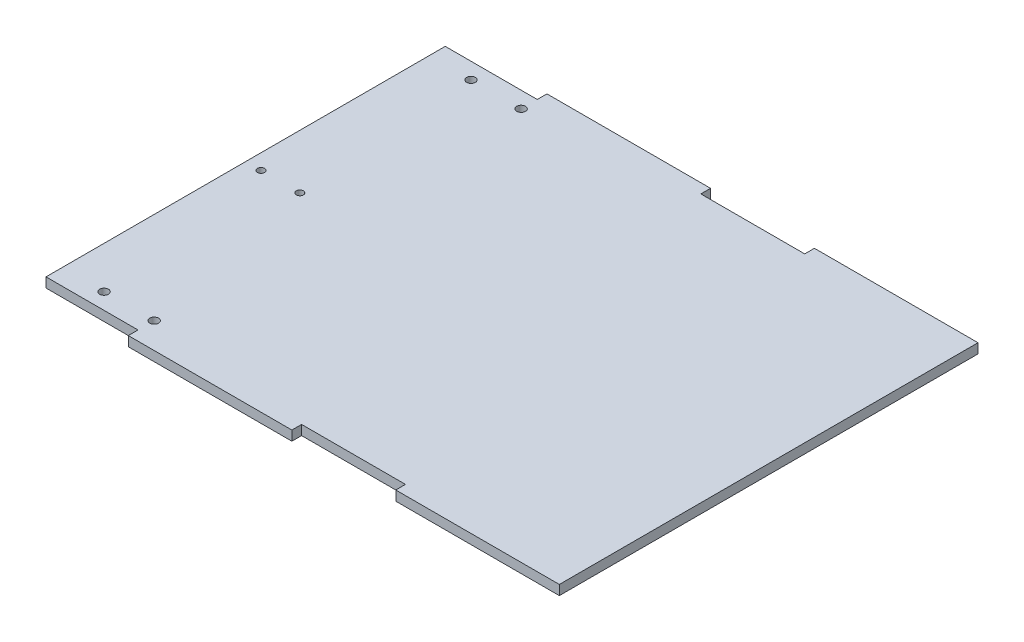
ISO-10303-21;
HEADER;
FILE_DESCRIPTION(('STEP AP214'),'2;1');
FILE_NAME('part.step','',(''),(''),'','','');
FILE_SCHEMA(('AUTOMOTIVE_DESIGN { 1 0 10303 214 1 1 1 1 }'));
ENDSEC;
DATA;
#1=APPLICATION_CONTEXT('core data for automotive mechanical design processes');
#2=APPLICATION_PROTOCOL_DEFINITION('international standard','automotive_design',2000,#1);
#3=PRODUCT_CONTEXT('',#1,'mechanical');
#4=PRODUCT('Part','Part','',(#3));
#5=PRODUCT_RELATED_PRODUCT_CATEGORY('part','',(#4));
#6=PRODUCT_DEFINITION_FORMATION('','',#4);
#7=PRODUCT_DEFINITION_CONTEXT('part definition',#1,'design');
#8=PRODUCT_DEFINITION('design','',#6,#7);
#9=PRODUCT_DEFINITION_SHAPE('','',#8);
#10=(LENGTH_UNIT() NAMED_UNIT(*) SI_UNIT(.MILLI.,.METRE.));
#11=(NAMED_UNIT(*) PLANE_ANGLE_UNIT() SI_UNIT($,.RADIAN.));
#12=(NAMED_UNIT(*) SI_UNIT($,.STERADIAN.) SOLID_ANGLE_UNIT());
#13=UNCERTAINTY_MEASURE_WITH_UNIT(LENGTH_MEASURE(1.E-05),#10,'distance_accuracy_value','');
#14=(GEOMETRIC_REPRESENTATION_CONTEXT(3) GLOBAL_UNCERTAINTY_ASSIGNED_CONTEXT((#13)) GLOBAL_UNIT_ASSIGNED_CONTEXT((#10,
#11,#12)) REPRESENTATION_CONTEXT('',''));
#15=CARTESIAN_POINT('',(0.,0.,0.));
#16=DIRECTION('',(0.,0.,1.));
#17=DIRECTION('',(1.,0.,0.));
#18=AXIS2_PLACEMENT_3D('',#15,#16,#17);
#19=CARTESIAN_POINT('',(-150.4,4.75,97.625));
#20=DIRECTION('',(1.,0.,0.));
#21=DIRECTION('',(0.,0.,-1.));
#22=AXIS2_PLACEMENT_3D('',#19,#20,#21);
#23=PLANE('',#22);
#24=DIRECTION('',(0.,0.,1.));
#25=VECTOR('',#24,1.);
#26=CARTESIAN_POINT('',(-150.4,0.,97.625));
#27=LINE('',#26,#25);
#28=CARTESIAN_POINT('',(-150.4,0.,-97.625));
#29=VERTEX_POINT('',#28);
#30=CARTESIAN_POINT('',(-150.4,0.,97.625));
#31=VERTEX_POINT('',#30);
#32=EDGE_CURVE('E176',#29,#31,#27,.T.);
#33=ORIENTED_EDGE('',*,*,#32,.T.);
#34=DIRECTION('',(0.,-1.,0.));
#35=VECTOR('',#34,1.);
#36=CARTESIAN_POINT('',(-150.4,4.75,97.625));
#37=LINE('',#36,#35);
#38=CARTESIAN_POINT('',(-150.4,4.75,97.625));
#39=VERTEX_POINT('',#38);
#40=EDGE_CURVE('E11',#39,#31,#37,.T.);
#41=ORIENTED_EDGE('',*,*,#40,.F.);
#42=DIRECTION('',(0.,0.,1.));
#43=VECTOR('',#42,1.);
#44=CARTESIAN_POINT('',(-150.4,4.75,97.625));
#45=LINE('',#44,#43);
#46=CARTESIAN_POINT('',(-150.4,4.75,-97.625));
#47=VERTEX_POINT('',#46);
#48=EDGE_CURVE('E208',#47,#39,#45,.T.);
#49=ORIENTED_EDGE('',*,*,#48,.F.);
#50=DIRECTION('',(0.,-1.,0.));
#51=VECTOR('',#50,1.);
#52=CARTESIAN_POINT('',(-150.4,4.75,-97.625));
#53=LINE('',#52,#51);
#54=EDGE_CURVE('E172',#47,#29,#53,.T.);
#55=ORIENTED_EDGE('',*,*,#54,.T.);
#56=EDGE_LOOP('',(#33,#41,#49,#55));
#57=FACE_BOUND('',#56,.T.);
#58=ADVANCED_FACE('F32',(#57),#23,.F.);
#59=CARTESIAN_POINT('',(-105.4,4.75,97.625));
#60=DIRECTION('',(0.,0.,-1.));
#61=DIRECTION('',(-1.,0.,0.));
#62=AXIS2_PLACEMENT_3D('',#59,#60,#61);
#63=PLANE('',#62);
#64=DIRECTION('',(1.,0.,0.));
#65=VECTOR('',#64,1.);
#66=CARTESIAN_POINT('',(-105.4,0.,97.625));
#67=LINE('',#66,#65);
#68=CARTESIAN_POINT('',(-105.4,0.,97.625));
#69=VERTEX_POINT('',#68);
#70=EDGE_CURVE('E179',#31,#69,#67,.T.);
#71=ORIENTED_EDGE('',*,*,#70,.T.);
#72=DIRECTION('',(0.,-1.,0.));
#73=VECTOR('',#72,1.);
#74=CARTESIAN_POINT('',(-105.4,4.75,97.625));
#75=LINE('',#74,#73);
#76=CARTESIAN_POINT('',(-105.4,4.75,97.625));
#77=VERTEX_POINT('',#76);
#78=EDGE_CURVE('E40',#77,#69,#75,.T.);
#79=ORIENTED_EDGE('',*,*,#78,.F.);
#80=DIRECTION('',(1.,0.,0.));
#81=VECTOR('',#80,1.);
#82=CARTESIAN_POINT('',(-105.4,4.75,97.625));
#83=LINE('',#82,#81);
#84=EDGE_CURVE('E115',#39,#77,#83,.T.);
#85=ORIENTED_EDGE('',*,*,#84,.F.);
#86=ORIENTED_EDGE('',*,*,#40,.T.);
#87=EDGE_LOOP('',(#71,#79,#85,#86));
#88=FACE_BOUND('',#87,.T.);
#89=ADVANCED_FACE('F308',(#88),#63,.F.);
#90=CARTESIAN_POINT('',(-105.4,4.75,97.625));
#91=DIRECTION('',(1.,0.,0.));
#92=DIRECTION('',(0.,0.,-1.));
#93=AXIS2_PLACEMENT_3D('',#90,#91,#92);
#94=PLANE('',#93);
#95=DIRECTION('',(0.,0.,1.));
#96=VECTOR('',#95,1.);
#97=CARTESIAN_POINT('',(-105.4,0.,97.625));
#98=LINE('',#97,#96);
#99=CARTESIAN_POINT('',(-105.4,0.,102.375));
#100=VERTEX_POINT('',#99);
#101=EDGE_CURVE('E182',#69,#100,#98,.T.);
#102=ORIENTED_EDGE('',*,*,#101,.T.);
#103=DIRECTION('',(0.,-1.,0.));
#104=VECTOR('',#103,1.);
#105=CARTESIAN_POINT('',(-105.4,4.75,102.375));
#106=LINE('',#105,#104);
#107=CARTESIAN_POINT('',(-105.4,4.75,102.375));
#108=VERTEX_POINT('',#107);
#109=EDGE_CURVE('E239',#108,#100,#106,.T.);
#110=ORIENTED_EDGE('',*,*,#109,.F.);
#111=DIRECTION('',(0.,0.,1.));
#112=VECTOR('',#111,1.);
#113=CARTESIAN_POINT('',(-105.4,4.75,97.625));
#114=LINE('',#113,#112);
#115=EDGE_CURVE('E247',#77,#108,#114,.T.);
#116=ORIENTED_EDGE('',*,*,#115,.F.);
#117=ORIENTED_EDGE('',*,*,#78,.T.);
#118=EDGE_LOOP('',(#102,#110,#116,#117));
#119=FACE_BOUND('',#118,.T.);
#120=ADVANCED_FACE('F245',(#119),#94,.F.);
#121=CARTESIAN_POINT('',(-105.4,4.75,102.375));
#122=DIRECTION('',(0.,0.,-1.));
#123=DIRECTION('',(-1.,0.,0.));
#124=AXIS2_PLACEMENT_3D('',#121,#122,#123);
#125=PLANE('',#124);
#126=DIRECTION('',(1.,0.,0.));
#127=VECTOR('',#126,1.);
#128=CARTESIAN_POINT('',(-105.4,0.,102.375));
#129=LINE('',#128,#127);
#130=CARTESIAN_POINT('',(-25.4,0.,102.375));
#131=VERTEX_POINT('',#130);
#132=EDGE_CURVE('E184',#100,#131,#129,.T.);
#133=ORIENTED_EDGE('',*,*,#132,.T.);
#134=DIRECTION('',(0.,-1.,0.));
#135=VECTOR('',#134,1.);
#136=CARTESIAN_POINT('',(-25.4,4.75,102.375));
#137=LINE('',#136,#135);
#138=CARTESIAN_POINT('',(-25.4,4.75,102.375));
#139=VERTEX_POINT('',#138);
#140=EDGE_CURVE('E236',#139,#131,#137,.T.);
#141=ORIENTED_EDGE('',*,*,#140,.F.);
#142=DIRECTION('',(1.,0.,0.));
#143=VECTOR('',#142,1.);
#144=CARTESIAN_POINT('',(-105.4,4.75,102.375));
#145=LINE('',#144,#143);
#146=EDGE_CURVE('E265',#108,#139,#145,.T.);
#147=ORIENTED_EDGE('',*,*,#146,.F.);
#148=ORIENTED_EDGE('',*,*,#109,.T.);
#149=EDGE_LOOP('',(#133,#141,#147,#148));
#150=FACE_BOUND('',#149,.T.);
#151=ADVANCED_FACE('F256',(#150),#125,.F.);
#152=CARTESIAN_POINT('',(-25.4,4.75,97.625));
#153=DIRECTION('',(-1.,0.,0.));
#154=DIRECTION('',(0.,0.,1.));
#155=AXIS2_PLACEMENT_3D('',#152,#153,#154);
#156=PLANE('',#155);
#157=DIRECTION('',(0.,0.,-1.));
#158=VECTOR('',#157,1.);
#159=CARTESIAN_POINT('',(-25.4,0.,97.625));
#160=LINE('',#159,#158);
#161=CARTESIAN_POINT('',(-25.4,0.,97.625));
#162=VERTEX_POINT('',#161);
#163=EDGE_CURVE('E186',#131,#162,#160,.T.);
#164=ORIENTED_EDGE('',*,*,#163,.T.);
#165=DIRECTION('',(0.,-1.,0.));
#166=VECTOR('',#165,1.);
#167=CARTESIAN_POINT('',(-25.4,4.75,97.625));
#168=LINE('',#167,#166);
#169=CARTESIAN_POINT('',(-25.4,4.75,97.625));
#170=VERTEX_POINT('',#169);
#171=EDGE_CURVE('E233',#170,#162,#168,.T.);
#172=ORIENTED_EDGE('',*,*,#171,.F.);
#173=DIRECTION('',(0.,0.,-1.));
#174=VECTOR('',#173,1.);
#175=CARTESIAN_POINT('',(-25.4,4.75,97.625));
#176=LINE('',#175,#174);
#177=EDGE_CURVE('E262',#139,#170,#176,.T.);
#178=ORIENTED_EDGE('',*,*,#177,.F.);
#179=ORIENTED_EDGE('',*,*,#140,.T.);
#180=EDGE_LOOP('',(#164,#172,#178,#179));
#181=FACE_BOUND('',#180,.T.);
#182=ADVANCED_FACE('F260',(#181),#156,.F.);
#183=CARTESIAN_POINT('',(25.4,4.75,97.625));
#184=DIRECTION('',(0.,0.,-1.));
#185=DIRECTION('',(-1.,0.,0.));
#186=AXIS2_PLACEMENT_3D('',#183,#184,#185);
#187=PLANE('',#186);
#188=DIRECTION('',(1.,0.,0.));
#189=VECTOR('',#188,1.);
#190=CARTESIAN_POINT('',(25.4,0.,97.625));
#191=LINE('',#190,#189);
#192=CARTESIAN_POINT('',(25.4,0.,97.625));
#193=VERTEX_POINT('',#192);
#194=EDGE_CURVE('E188',#162,#193,#191,.T.);
#195=ORIENTED_EDGE('',*,*,#194,.T.);
#196=DIRECTION('',(0.,-1.,0.));
#197=VECTOR('',#196,1.);
#198=CARTESIAN_POINT('',(25.4,4.75,97.625));
#199=LINE('',#198,#197);
#200=CARTESIAN_POINT('',(25.4,4.75,97.625));
#201=VERTEX_POINT('',#200);
#202=EDGE_CURVE('E230',#201,#193,#199,.T.);
#203=ORIENTED_EDGE('',*,*,#202,.F.);
#204=DIRECTION('',(1.,0.,0.));
#205=VECTOR('',#204,1.);
#206=CARTESIAN_POINT('',(25.4,4.75,97.625));
#207=LINE('',#206,#205);
#208=EDGE_CURVE('E264',#170,#201,#207,.T.);
#209=ORIENTED_EDGE('',*,*,#208,.F.);
#210=ORIENTED_EDGE('',*,*,#171,.T.);
#211=EDGE_LOOP('',(#195,#203,#209,#210));
#212=FACE_BOUND('',#211,.T.);
#213=ADVANCED_FACE('F321',(#212),#187,.F.);
#214=CARTESIAN_POINT('',(25.4,4.75,97.625));
#215=DIRECTION('',(1.,0.,0.));
#216=DIRECTION('',(0.,0.,-1.));
#217=AXIS2_PLACEMENT_3D('',#214,#215,#216);
#218=PLANE('',#217);
#219=DIRECTION('',(0.,0.,1.));
#220=VECTOR('',#219,1.);
#221=CARTESIAN_POINT('',(25.4,0.,97.625));
#222=LINE('',#221,#220);
#223=CARTESIAN_POINT('',(25.4,0.,102.375));
#224=VERTEX_POINT('',#223);
#225=EDGE_CURVE('E190',#193,#224,#222,.T.);
#226=ORIENTED_EDGE('',*,*,#225,.T.);
#227=DIRECTION('',(0.,-1.,0.));
#228=VECTOR('',#227,1.);
#229=CARTESIAN_POINT('',(25.4,4.75,102.375));
#230=LINE('',#229,#228);
#231=CARTESIAN_POINT('',(25.4,4.75,102.375));
#232=VERTEX_POINT('',#231);
#233=EDGE_CURVE('E227',#232,#224,#230,.T.);
#234=ORIENTED_EDGE('',*,*,#233,.F.);
#235=DIRECTION('',(0.,0.,1.));
#236=VECTOR('',#235,1.);
#237=CARTESIAN_POINT('',(25.4,4.75,97.625));
#238=LINE('',#237,#236);
#239=EDGE_CURVE('E267',#201,#232,#238,.T.);
#240=ORIENTED_EDGE('',*,*,#239,.F.);
#241=ORIENTED_EDGE('',*,*,#202,.T.);
#242=EDGE_LOOP('',(#226,#234,#240,#241));
#243=FACE_BOUND('',#242,.T.);
#244=ADVANCED_FACE('F324',(#243),#218,.F.);
#245=CARTESIAN_POINT('',(25.4,4.75,102.375));
#246=DIRECTION('',(0.,0.,-1.));
#247=DIRECTION('',(-1.,0.,0.));
#248=AXIS2_PLACEMENT_3D('',#245,#246,#247);
#249=PLANE('',#248);
#250=DIRECTION('',(1.,0.,0.));
#251=VECTOR('',#250,1.);
#252=CARTESIAN_POINT('',(25.4,0.,102.375));
#253=LINE('',#252,#251);
#254=CARTESIAN_POINT('',(105.4,0.,102.375));
#255=VERTEX_POINT('',#254);
#256=EDGE_CURVE('E192',#224,#255,#253,.T.);
#257=ORIENTED_EDGE('',*,*,#256,.T.);
#258=DIRECTION('',(0.,-1.,0.));
#259=VECTOR('',#258,1.);
#260=CARTESIAN_POINT('',(105.4,4.75,102.375));
#261=LINE('',#260,#259);
#262=CARTESIAN_POINT('',(105.4,4.75,102.375));
#263=VERTEX_POINT('',#262);
#264=EDGE_CURVE('E224',#263,#255,#261,.T.);
#265=ORIENTED_EDGE('',*,*,#264,.F.);
#266=DIRECTION('',(1.,0.,0.));
#267=VECTOR('',#266,1.);
#268=CARTESIAN_POINT('',(25.4,4.75,102.375));
#269=LINE('',#268,#267);
#270=EDGE_CURVE('E273',#232,#263,#269,.T.);
#271=ORIENTED_EDGE('',*,*,#270,.F.);
#272=ORIENTED_EDGE('',*,*,#233,.T.);
#273=EDGE_LOOP('',(#257,#265,#271,#272));
#274=FACE_BOUND('',#273,.T.);
#275=ADVANCED_FACE('F328',(#274),#249,.F.);
#276=CARTESIAN_POINT('',(105.4,4.75,-97.625));
#277=DIRECTION('',(-1.,0.,0.));
#278=DIRECTION('',(0.,0.,1.));
#279=AXIS2_PLACEMENT_3D('',#276,#277,#278);
#280=PLANE('',#279);
#281=DIRECTION('',(0.,0.,-1.));
#282=VECTOR('',#281,1.);
#283=CARTESIAN_POINT('',(105.4,0.,-97.625));
#284=LINE('',#283,#282);
#285=CARTESIAN_POINT('',(105.4,0.,-102.375));
#286=VERTEX_POINT('',#285);
#287=EDGE_CURVE('E195',#255,#286,#284,.T.);
#288=ORIENTED_EDGE('',*,*,#287,.T.);
#289=DIRECTION('',(0.,-1.,0.));
#290=VECTOR('',#289,1.);
#291=CARTESIAN_POINT('',(105.4,4.75,-102.375));
#292=LINE('',#291,#290);
#293=CARTESIAN_POINT('',(105.4,4.75,-102.375));
#294=VERTEX_POINT('',#293);
#295=EDGE_CURVE('E221',#294,#286,#292,.T.);
#296=ORIENTED_EDGE('',*,*,#295,.F.);
#297=DIRECTION('',(0.,0.,-1.));
#298=VECTOR('',#297,1.);
#299=CARTESIAN_POINT('',(105.4,4.75,97.625));
#300=LINE('',#299,#298);
#301=EDGE_CURVE('E275',#263,#294,#300,.T.);
#302=ORIENTED_EDGE('',*,*,#301,.F.);
#303=ORIENTED_EDGE('',*,*,#264,.T.);
#304=EDGE_LOOP('',(#288,#296,#302,#303));
#305=FACE_BOUND('',#304,.T.);
#306=ADVANCED_FACE('F332',(#305),#280,.F.);
#307=CARTESIAN_POINT('',(25.4,4.75,-102.375));
#308=DIRECTION('',(0.,0.,1.));
#309=DIRECTION('',(1.,0.,0.));
#310=AXIS2_PLACEMENT_3D('',#307,#308,#309);
#311=PLANE('',#310);
#312=DIRECTION('',(-1.,0.,0.));
#313=VECTOR('',#312,1.);
#314=CARTESIAN_POINT('',(25.4,0.,-102.375));
#315=LINE('',#314,#313);
#316=CARTESIAN_POINT('',(25.4,0.,-102.375));
#317=VERTEX_POINT('',#316);
#318=EDGE_CURVE('E197',#286,#317,#315,.T.);
#319=ORIENTED_EDGE('',*,*,#318,.T.);
#320=DIRECTION('',(0.,-1.,0.));
#321=VECTOR('',#320,1.);
#322=CARTESIAN_POINT('',(25.4,4.75,-102.375));
#323=LINE('',#322,#321);
#324=CARTESIAN_POINT('',(25.4,4.75,-102.375));
#325=VERTEX_POINT('',#324);
#326=EDGE_CURVE('E218',#325,#317,#323,.T.);
#327=ORIENTED_EDGE('',*,*,#326,.F.);
#328=DIRECTION('',(-1.,0.,0.));
#329=VECTOR('',#328,1.);
#330=CARTESIAN_POINT('',(25.4,4.75,-102.375));
#331=LINE('',#330,#329);
#332=EDGE_CURVE('E277',#294,#325,#331,.T.);
#333=ORIENTED_EDGE('',*,*,#332,.F.);
#334=ORIENTED_EDGE('',*,*,#295,.T.);
#335=EDGE_LOOP('',(#319,#327,#333,#334));
#336=FACE_BOUND('',#335,.T.);
#337=ADVANCED_FACE('F336',(#336),#311,.F.);
#338=CARTESIAN_POINT('',(25.4,4.75,-97.625));
#339=DIRECTION('',(1.,0.,0.));
#340=DIRECTION('',(0.,0.,-1.));
#341=AXIS2_PLACEMENT_3D('',#338,#339,#340);
#342=PLANE('',#341);
#343=DIRECTION('',(0.,0.,1.));
#344=VECTOR('',#343,1.);
#345=CARTESIAN_POINT('',(25.4,0.,-97.625));
#346=LINE('',#345,#344);
#347=CARTESIAN_POINT('',(25.4,0.,-97.625));
#348=VERTEX_POINT('',#347);
#349=EDGE_CURVE('E199',#317,#348,#346,.T.);
#350=ORIENTED_EDGE('',*,*,#349,.T.);
#351=DIRECTION('',(0.,-1.,0.));
#352=VECTOR('',#351,1.);
#353=CARTESIAN_POINT('',(25.4,4.75,-97.625));
#354=LINE('',#353,#352);
#355=CARTESIAN_POINT('',(25.4,4.75,-97.625));
#356=VERTEX_POINT('',#355);
#357=EDGE_CURVE('E215',#356,#348,#354,.T.);
#358=ORIENTED_EDGE('',*,*,#357,.F.);
#359=DIRECTION('',(0.,0.,1.));
#360=VECTOR('',#359,1.);
#361=CARTESIAN_POINT('',(25.4,4.75,-97.625));
#362=LINE('',#361,#360);
#363=EDGE_CURVE('E279',#325,#356,#362,.T.);
#364=ORIENTED_EDGE('',*,*,#363,.F.);
#365=ORIENTED_EDGE('',*,*,#326,.T.);
#366=EDGE_LOOP('',(#350,#358,#364,#365));
#367=FACE_BOUND('',#366,.T.);
#368=ADVANCED_FACE('F340',(#367),#342,.F.);
#369=CARTESIAN_POINT('',(25.4,4.75,-97.625));
#370=DIRECTION('',(0.,0.,1.));
#371=DIRECTION('',(1.,0.,0.));
#372=AXIS2_PLACEMENT_3D('',#369,#370,#371);
#373=PLANE('',#372);
#374=DIRECTION('',(-1.,0.,0.));
#375=VECTOR('',#374,1.);
#376=CARTESIAN_POINT('',(25.4,0.,-97.625));
#377=LINE('',#376,#375);
#378=CARTESIAN_POINT('',(-25.4,0.,-97.625));
#379=VERTEX_POINT('',#378);
#380=EDGE_CURVE('E201',#348,#379,#377,.T.);
#381=ORIENTED_EDGE('',*,*,#380,.T.);
#382=DIRECTION('',(0.,-1.,0.));
#383=VECTOR('',#382,1.);
#384=CARTESIAN_POINT('',(-25.4,4.75,-97.625));
#385=LINE('',#384,#383);
#386=CARTESIAN_POINT('',(-25.4,4.75,-97.625));
#387=VERTEX_POINT('',#386);
#388=EDGE_CURVE('E212',#387,#379,#385,.T.);
#389=ORIENTED_EDGE('',*,*,#388,.F.);
#390=DIRECTION('',(-1.,0.,0.));
#391=VECTOR('',#390,1.);
#392=CARTESIAN_POINT('',(25.4,4.75,-97.625));
#393=LINE('',#392,#391);
#394=EDGE_CURVE('E281',#356,#387,#393,.T.);
#395=ORIENTED_EDGE('',*,*,#394,.F.);
#396=ORIENTED_EDGE('',*,*,#357,.T.);
#397=EDGE_LOOP('',(#381,#389,#395,#396));
#398=FACE_BOUND('',#397,.T.);
#399=ADVANCED_FACE('F287',(#398),#373,.F.);
#400=CARTESIAN_POINT('',(-25.4,4.75,-97.625));
#401=DIRECTION('',(-1.,0.,0.));
#402=DIRECTION('',(0.,0.,1.));
#403=AXIS2_PLACEMENT_3D('',#400,#401,#402);
#404=PLANE('',#403);
#405=DIRECTION('',(0.,0.,-1.));
#406=VECTOR('',#405,1.);
#407=CARTESIAN_POINT('',(-25.4,0.,-97.625));
#408=LINE('',#407,#406);
#409=CARTESIAN_POINT('',(-25.4,0.,-102.375));
#410=VERTEX_POINT('',#409);
#411=EDGE_CURVE('E203',#379,#410,#408,.T.);
#412=ORIENTED_EDGE('',*,*,#411,.T.);
#413=DIRECTION('',(0.,-1.,0.));
#414=VECTOR('',#413,1.);
#415=CARTESIAN_POINT('',(-25.4,4.75,-102.375));
#416=LINE('',#415,#414);
#417=CARTESIAN_POINT('',(-25.4,4.75,-102.375));
#418=VERTEX_POINT('',#417);
#419=EDGE_CURVE('E167',#418,#410,#416,.T.);
#420=ORIENTED_EDGE('',*,*,#419,.F.);
#421=DIRECTION('',(0.,0.,-1.));
#422=VECTOR('',#421,1.);
#423=CARTESIAN_POINT('',(-25.4,4.75,-97.625));
#424=LINE('',#423,#422);
#425=EDGE_CURVE('E158',#387,#418,#424,.T.);
#426=ORIENTED_EDGE('',*,*,#425,.F.);
#427=ORIENTED_EDGE('',*,*,#388,.T.);
#428=EDGE_LOOP('',(#412,#420,#426,#427));
#429=FACE_BOUND('',#428,.T.);
#430=ADVANCED_FACE('F291',(#429),#404,.F.);
#431=CARTESIAN_POINT('',(-105.4,4.75,-102.375));
#432=DIRECTION('',(0.,0.,1.));
#433=DIRECTION('',(1.,0.,0.));
#434=AXIS2_PLACEMENT_3D('',#431,#432,#433);
#435=PLANE('',#434);
#436=DIRECTION('',(-1.,0.,0.));
#437=VECTOR('',#436,1.);
#438=CARTESIAN_POINT('',(-105.4,0.,-102.375));
#439=LINE('',#438,#437);
#440=CARTESIAN_POINT('',(-105.4,0.,-102.375));
#441=VERTEX_POINT('',#440);
#442=EDGE_CURVE('E166',#410,#441,#439,.T.);
#443=ORIENTED_EDGE('',*,*,#442,.T.);
#444=DIRECTION('',(0.,-1.,0.));
#445=VECTOR('',#444,1.);
#446=CARTESIAN_POINT('',(-105.4,4.75,-102.375));
#447=LINE('',#446,#445);
#448=CARTESIAN_POINT('',(-105.4,4.75,-102.375));
#449=VERTEX_POINT('',#448);
#450=EDGE_CURVE('E163',#449,#441,#447,.T.);
#451=ORIENTED_EDGE('',*,*,#450,.F.);
#452=DIRECTION('',(-1.,0.,0.));
#453=VECTOR('',#452,1.);
#454=CARTESIAN_POINT('',(-105.4,4.75,-102.375));
#455=LINE('',#454,#453);
#456=EDGE_CURVE('E152',#418,#449,#455,.T.);
#457=ORIENTED_EDGE('',*,*,#456,.F.);
#458=ORIENTED_EDGE('',*,*,#419,.T.);
#459=EDGE_LOOP('',(#443,#451,#457,#458));
#460=FACE_BOUND('',#459,.T.);
#461=ADVANCED_FACE('F164',(#460),#435,.F.);
#462=CARTESIAN_POINT('',(-105.4,4.75,-97.625));
#463=DIRECTION('',(1.,0.,0.));
#464=DIRECTION('',(0.,0.,-1.));
#465=AXIS2_PLACEMENT_3D('',#462,#463,#464);
#466=PLANE('',#465);
#467=DIRECTION('',(0.,0.,1.));
#468=VECTOR('',#467,1.);
#469=CARTESIAN_POINT('',(-105.4,0.,-97.625));
#470=LINE('',#469,#468);
#471=CARTESIAN_POINT('',(-105.4,0.,-97.625));
#472=VERTEX_POINT('',#471);
#473=EDGE_CURVE('E101',#441,#472,#470,.T.);
#474=ORIENTED_EDGE('',*,*,#473,.T.);
#475=DIRECTION('',(0.,-1.,0.));
#476=VECTOR('',#475,1.);
#477=CARTESIAN_POINT('',(-105.4,4.75,-97.625));
#478=LINE('',#477,#476);
#479=CARTESIAN_POINT('',(-105.4,4.75,-97.625));
#480=VERTEX_POINT('',#479);
#481=EDGE_CURVE('E168',#480,#472,#478,.T.);
#482=ORIENTED_EDGE('',*,*,#481,.F.);
#483=DIRECTION('',(0.,0.,1.));
#484=VECTOR('',#483,1.);
#485=CARTESIAN_POINT('',(-105.4,4.75,-97.625));
#486=LINE('',#485,#484);
#487=EDGE_CURVE('E156',#449,#480,#486,.T.);
#488=ORIENTED_EDGE('',*,*,#487,.F.);
#489=ORIENTED_EDGE('',*,*,#450,.T.);
#490=EDGE_LOOP('',(#474,#482,#488,#489));
#491=FACE_BOUND('',#490,.T.);
#492=ADVANCED_FACE('F170',(#491),#466,.F.);
#493=CARTESIAN_POINT('',(-105.4,4.75,-97.625));
#494=DIRECTION('',(0.,0.,1.));
#495=DIRECTION('',(1.,0.,0.));
#496=AXIS2_PLACEMENT_3D('',#493,#494,#495);
#497=PLANE('',#496);
#498=DIRECTION('',(-1.,0.,0.));
#499=VECTOR('',#498,1.);
#500=CARTESIAN_POINT('',(-105.4,0.,-97.625));
#501=LINE('',#500,#499);
#502=EDGE_CURVE('E107',#472,#29,#501,.T.);
#503=ORIENTED_EDGE('',*,*,#502,.T.);
#504=ORIENTED_EDGE('',*,*,#54,.F.);
#505=DIRECTION('',(-1.,0.,0.));
#506=VECTOR('',#505,1.);
#507=CARTESIAN_POINT('',(-105.4,4.75,-97.625));
#508=LINE('',#507,#506);
#509=EDGE_CURVE('E48',#480,#47,#508,.T.);
#510=ORIENTED_EDGE('',*,*,#509,.F.);
#511=ORIENTED_EDGE('',*,*,#481,.T.);
#512=EDGE_LOOP('',(#503,#504,#510,#511));
#513=FACE_BOUND('',#512,.T.);
#514=ADVANCED_FACE('F295',(#513),#497,.F.);
#515=CARTESIAN_POINT('',(0.,4.75,0.));
#516=DIRECTION('',(0.,1.,0.));
#517=DIRECTION('',(0.,0.,1.));
#518=AXIS2_PLACEMENT_3D('',#515,#516,#517);
#519=PLANE('',#518);
#520=CARTESIAN_POINT('',(-129.899999999999,4.75,89.7249999999999));
#521=DIRECTION('',(0.,1.,0.));
#522=DIRECTION('',(0.,0.,1.));
#523=AXIS2_PLACEMENT_3D('',#520,#521,#522);
#524=CIRCLE('',#523,2.14999999999999);
#525=CARTESIAN_POINT('',(-129.899999999999,4.75,91.8749999999999));
#526=VERTEX_POINT('',#525);
#527=EDGE_CURVE('E441',#526,#526,#524,.T.);
#528=ORIENTED_EDGE('',*,*,#527,.F.);
#529=EDGE_LOOP('',(#528));
#530=FACE_BOUND('',#529,.T.);
#531=CARTESIAN_POINT('',(-105.399999999999,4.75,-89.724999999744));
#532=DIRECTION('',(0.,1.,0.));
#533=DIRECTION('',(0.,0.,1.));
#534=AXIS2_PLACEMENT_3D('',#531,#532,#533);
#535=CIRCLE('',#534,2.15000000028626);
#536=CARTESIAN_POINT('',(-105.399999999999,4.75,-87.5749999994578));
#537=VERTEX_POINT('',#536);
#538=EDGE_CURVE('E447',#537,#537,#535,.T.);
#539=ORIENTED_EDGE('',*,*,#538,.F.);
#540=EDGE_LOOP('',(#539));
#541=FACE_BOUND('',#540,.T.);
#542=CARTESIAN_POINT('',(-129.899999999999,4.75,-89.7249999997441));
#543=DIRECTION('',(0.,1.,0.));
#544=DIRECTION('',(0.,0.,1.));
#545=AXIS2_PLACEMENT_3D('',#542,#543,#544);
#546=CIRCLE('',#545,2.15000000028627);
#547=CARTESIAN_POINT('',(-129.899999999999,4.75,-87.5749999994578));
#548=VERTEX_POINT('',#547);
#549=EDGE_CURVE('E489',#548,#548,#546,.T.);
#550=ORIENTED_EDGE('',*,*,#549,.F.);
#551=EDGE_LOOP('',(#550));
#552=FACE_BOUND('',#551,.T.);
#553=CARTESIAN_POINT('',(-105.399999999999,4.75,89.725));
#554=DIRECTION('',(0.,1.,0.));
#555=DIRECTION('',(0.,0.,1.));
#556=AXIS2_PLACEMENT_3D('',#553,#554,#555);
#557=CIRCLE('',#556,2.15);
#558=CARTESIAN_POINT('',(-105.399999999999,4.75,91.875));
#559=VERTEX_POINT('',#558);
#560=EDGE_CURVE('E444',#559,#559,#557,.T.);
#561=ORIENTED_EDGE('',*,*,#560,.F.);
#562=EDGE_LOOP('',(#561));
#563=FACE_BOUND('',#562,.T.);
#564=CARTESIAN_POINT('',(-123.899999999998,4.75,-3.59781992967109E-13));
#565=DIRECTION('',(0.,1.,0.));
#566=DIRECTION('',(0.,0.,1.));
#567=AXIS2_PLACEMENT_3D('',#564,#565,#566);
#568=CIRCLE('',#567,1.75000000000001);
#569=CARTESIAN_POINT('',(-123.899999999998,4.75,1.74999999999965));
#570=VERTEX_POINT('',#569);
#571=EDGE_CURVE('E462',#570,#570,#568,.T.);
#572=ORIENTED_EDGE('',*,*,#571,.F.);
#573=EDGE_LOOP('',(#572));
#574=FACE_BOUND('',#573,.T.);
#575=CARTESIAN_POINT('',(-142.899999999998,4.75,-3.3202641735148E-13));
#576=DIRECTION('',(0.,1.,0.));
#577=DIRECTION('',(0.,0.,1.));
#578=AXIS2_PLACEMENT_3D('',#575,#576,#577);
#579=CIRCLE('',#578,1.75000000000001);
#580=CARTESIAN_POINT('',(-142.899999999998,4.75,1.74999999999968));
#581=VERTEX_POINT('',#580);
#582=EDGE_CURVE('E457',#581,#581,#579,.T.);
#583=ORIENTED_EDGE('',*,*,#582,.F.);
#584=EDGE_LOOP('',(#583));
#585=FACE_BOUND('',#584,.T.);
#586=ORIENTED_EDGE('',*,*,#48,.T.);
#587=ORIENTED_EDGE('',*,*,#84,.T.);
#588=ORIENTED_EDGE('',*,*,#115,.T.);
#589=ORIENTED_EDGE('',*,*,#146,.T.);
#590=ORIENTED_EDGE('',*,*,#177,.T.);
#591=ORIENTED_EDGE('',*,*,#208,.T.);
#592=ORIENTED_EDGE('',*,*,#239,.T.);
#593=ORIENTED_EDGE('',*,*,#270,.T.);
#594=ORIENTED_EDGE('',*,*,#301,.T.);
#595=ORIENTED_EDGE('',*,*,#332,.T.);
#596=ORIENTED_EDGE('',*,*,#363,.T.);
#597=ORIENTED_EDGE('',*,*,#394,.T.);
#598=ORIENTED_EDGE('',*,*,#425,.T.);
#599=ORIENTED_EDGE('',*,*,#456,.T.);
#600=ORIENTED_EDGE('',*,*,#487,.T.);
#601=ORIENTED_EDGE('',*,*,#509,.T.);
#602=EDGE_LOOP('',(#586,#587,#588,#589,#590,#591,#592,#593,#594,#595,#596,#597,#598,#599,#600,#601));
#603=FACE_BOUND('',#602,.T.);
#604=ADVANCED_FACE('F154',(#530,#541,#552,#563,#574,#585,#603),#519,.T.);
#605=CARTESIAN_POINT('',(0.,0.,0.));
#606=DIRECTION('',(0.,1.,0.));
#607=DIRECTION('',(0.,0.,1.));
#608=AXIS2_PLACEMENT_3D('',#605,#606,#607);
#609=PLANE('',#608);
#610=CARTESIAN_POINT('',(-129.899999999999,0.,89.7249999999999));
#611=DIRECTION('',(0.,1.,0.));
#612=DIRECTION('',(0.,0.,1.));
#613=AXIS2_PLACEMENT_3D('',#610,#611,#612);
#614=CIRCLE('',#613,2.14999999999999);
#615=CARTESIAN_POINT('',(-129.899999999999,0.,91.8749999999999));
#616=VERTEX_POINT('',#615);
#617=EDGE_CURVE('E438',#616,#616,#614,.T.);
#618=ORIENTED_EDGE('',*,*,#617,.T.);
#619=EDGE_LOOP('',(#618));
#620=FACE_BOUND('',#619,.T.);
#621=CARTESIAN_POINT('',(-105.399999999999,0.,-89.724999999744));
#622=DIRECTION('',(0.,1.,0.));
#623=DIRECTION('',(0.,0.,1.));
#624=AXIS2_PLACEMENT_3D('',#621,#622,#623);
#625=CIRCLE('',#624,2.15000000028626);
#626=CARTESIAN_POINT('',(-105.399999999999,0.,-87.5749999994578));
#627=VERTEX_POINT('',#626);
#628=EDGE_CURVE('E442',#627,#627,#625,.T.);
#629=ORIENTED_EDGE('',*,*,#628,.T.);
#630=EDGE_LOOP('',(#629));
#631=FACE_BOUND('',#630,.T.);
#632=CARTESIAN_POINT('',(-129.899999999999,0.,-89.7249999997441));
#633=DIRECTION('',(0.,1.,0.));
#634=DIRECTION('',(0.,0.,1.));
#635=AXIS2_PLACEMENT_3D('',#632,#633,#634);
#636=CIRCLE('',#635,2.15000000028627);
#637=CARTESIAN_POINT('',(-129.899999999999,0.,-87.5749999994578));
#638=VERTEX_POINT('',#637);
#639=EDGE_CURVE('E453',#638,#638,#636,.T.);
#640=ORIENTED_EDGE('',*,*,#639,.T.);
#641=EDGE_LOOP('',(#640));
#642=FACE_BOUND('',#641,.T.);
#643=CARTESIAN_POINT('',(-105.399999999999,0.,89.725));
#644=DIRECTION('',(0.,1.,0.));
#645=DIRECTION('',(0.,0.,1.));
#646=AXIS2_PLACEMENT_3D('',#643,#644,#645);
#647=CIRCLE('',#646,2.15);
#648=CARTESIAN_POINT('',(-105.399999999999,0.,91.875));
#649=VERTEX_POINT('',#648);
#650=EDGE_CURVE('E454',#649,#649,#647,.T.);
#651=ORIENTED_EDGE('',*,*,#650,.T.);
#652=EDGE_LOOP('',(#651));
#653=FACE_BOUND('',#652,.T.);
#654=CARTESIAN_POINT('',(-123.899999999998,0.,-3.59781992967109E-13));
#655=DIRECTION('',(0.,1.,0.));
#656=DIRECTION('',(0.,0.,1.));
#657=AXIS2_PLACEMENT_3D('',#654,#655,#656);
#658=CIRCLE('',#657,1.75000000000001);
#659=CARTESIAN_POINT('',(-123.899999999998,0.,1.74999999999965));
#660=VERTEX_POINT('',#659);
#661=EDGE_CURVE('E180',#660,#660,#658,.T.);
#662=ORIENTED_EDGE('',*,*,#661,.T.);
#663=EDGE_LOOP('',(#662));
#664=FACE_BOUND('',#663,.T.);
#665=CARTESIAN_POINT('',(-142.899999999998,0.,-3.3202641735148E-13));
#666=DIRECTION('',(0.,1.,0.));
#667=DIRECTION('',(0.,0.,1.));
#668=AXIS2_PLACEMENT_3D('',#665,#666,#667);
#669=CIRCLE('',#668,1.75000000000001);
#670=CARTESIAN_POINT('',(-142.899999999998,0.,1.74999999999968));
#671=VERTEX_POINT('',#670);
#672=EDGE_CURVE('E465',#671,#671,#669,.T.);
#673=ORIENTED_EDGE('',*,*,#672,.T.);
#674=EDGE_LOOP('',(#673));
#675=FACE_BOUND('',#674,.T.);
#676=ORIENTED_EDGE('',*,*,#32,.F.);
#677=ORIENTED_EDGE('',*,*,#502,.F.);
#678=ORIENTED_EDGE('',*,*,#473,.F.);
#679=ORIENTED_EDGE('',*,*,#442,.F.);
#680=ORIENTED_EDGE('',*,*,#411,.F.);
#681=ORIENTED_EDGE('',*,*,#380,.F.);
#682=ORIENTED_EDGE('',*,*,#349,.F.);
#683=ORIENTED_EDGE('',*,*,#318,.F.);
#684=ORIENTED_EDGE('',*,*,#287,.F.);
#685=ORIENTED_EDGE('',*,*,#256,.F.);
#686=ORIENTED_EDGE('',*,*,#225,.F.);
#687=ORIENTED_EDGE('',*,*,#194,.F.);
#688=ORIENTED_EDGE('',*,*,#163,.F.);
#689=ORIENTED_EDGE('',*,*,#132,.F.);
#690=ORIENTED_EDGE('',*,*,#101,.F.);
#691=ORIENTED_EDGE('',*,*,#70,.F.);
#692=EDGE_LOOP('',(#676,#677,#678,#679,#680,#681,#682,#683,#684,#685,#686,#687,#688,#689,#690,#691));
#693=FACE_BOUND('',#692,.T.);
#694=ADVANCED_FACE('F251',(#620,#631,#642,#653,#664,#675,#693),#609,.F.);
#695=CARTESIAN_POINT('',(-142.899999999998,0.,-3.3202641735148E-13));
#696=DIRECTION('',(0.,1.,0.));
#697=DIRECTION('',(0.,0.,1.));
#698=AXIS2_PLACEMENT_3D('',#695,#696,#697);
#699=CYLINDRICAL_SURFACE('',#698,1.75000000000001);
#700=ORIENTED_EDGE('',*,*,#672,.F.);
#701=EDGE_LOOP('',(#700));
#702=FACE_BOUND('',#701,.T.);
#703=ORIENTED_EDGE('',*,*,#582,.T.);
#704=EDGE_LOOP('',(#703));
#705=FACE_BOUND('',#704,.T.);
#706=ADVANCED_FACE('F368',(#702,#705),#699,.F.);
#707=CARTESIAN_POINT('',(-123.899999999998,0.,-3.59781992967109E-13));
#708=DIRECTION('',(0.,1.,0.));
#709=DIRECTION('',(0.,0.,1.));
#710=AXIS2_PLACEMENT_3D('',#707,#708,#709);
#711=CYLINDRICAL_SURFACE('',#710,1.75000000000001);
#712=ORIENTED_EDGE('',*,*,#661,.F.);
#713=EDGE_LOOP('',(#712));
#714=FACE_BOUND('',#713,.T.);
#715=ORIENTED_EDGE('',*,*,#571,.T.);
#716=EDGE_LOOP('',(#715));
#717=FACE_BOUND('',#716,.T.);
#718=ADVANCED_FACE('F373',(#714,#717),#711,.F.);
#719=CARTESIAN_POINT('',(-105.399999999999,0.,89.725));
#720=DIRECTION('',(0.,1.,0.));
#721=DIRECTION('',(0.,0.,1.));
#722=AXIS2_PLACEMENT_3D('',#719,#720,#721);
#723=CYLINDRICAL_SURFACE('',#722,2.15);
#724=ORIENTED_EDGE('',*,*,#650,.F.);
#725=EDGE_LOOP('',(#724));
#726=FACE_BOUND('',#725,.T.);
#727=ORIENTED_EDGE('',*,*,#560,.T.);
#728=EDGE_LOOP('',(#727));
#729=FACE_BOUND('',#728,.T.);
#730=ADVANCED_FACE('F384',(#726,#729),#723,.F.);
#731=CARTESIAN_POINT('',(-129.899999999999,0.,-89.7249999997441));
#732=DIRECTION('',(0.,1.,0.));
#733=DIRECTION('',(0.,0.,1.));
#734=AXIS2_PLACEMENT_3D('',#731,#732,#733);
#735=CYLINDRICAL_SURFACE('',#734,2.15000000028627);
#736=ORIENTED_EDGE('',*,*,#639,.F.);
#737=EDGE_LOOP('',(#736));
#738=FACE_BOUND('',#737,.T.);
#739=ORIENTED_EDGE('',*,*,#549,.T.);
#740=EDGE_LOOP('',(#739));
#741=FACE_BOUND('',#740,.T.);
#742=ADVANCED_FACE('F401',(#738,#741),#735,.F.);
#743=CARTESIAN_POINT('',(-105.399999999999,0.,-89.724999999744));
#744=DIRECTION('',(0.,1.,0.));
#745=DIRECTION('',(0.,0.,1.));
#746=AXIS2_PLACEMENT_3D('',#743,#744,#745);
#747=CYLINDRICAL_SURFACE('',#746,2.15000000028626);
#748=ORIENTED_EDGE('',*,*,#628,.F.);
#749=EDGE_LOOP('',(#748));
#750=FACE_BOUND('',#749,.T.);
#751=ORIENTED_EDGE('',*,*,#538,.T.);
#752=EDGE_LOOP('',(#751));
#753=FACE_BOUND('',#752,.T.);
#754=ADVANCED_FACE('F411',(#750,#753),#747,.F.);
#755=CARTESIAN_POINT('',(-129.899999999999,0.,89.7249999999999));
#756=DIRECTION('',(0.,1.,0.));
#757=DIRECTION('',(0.,0.,1.));
#758=AXIS2_PLACEMENT_3D('',#755,#756,#757);
#759=CYLINDRICAL_SURFACE('',#758,2.14999999999999);
#760=ORIENTED_EDGE('',*,*,#617,.F.);
#761=EDGE_LOOP('',(#760));
#762=FACE_BOUND('',#761,.T.);
#763=ORIENTED_EDGE('',*,*,#527,.T.);
#764=EDGE_LOOP('',(#763));
#765=FACE_BOUND('',#764,.T.);
#766=ADVANCED_FACE('F421',(#762,#765),#759,.F.);
#767=CLOSED_SHELL('',(#58,#89,#120,#151,#182,#213,#244,#275,#306,#337,#368,#399,#430,#461,#492,
#514,#604,#694,#706,#718,#730,#742,#754,#766));
#768=MANIFOLD_SOLID_BREP('B2',#767);
#769=ADVANCED_BREP_SHAPE_REPRESENTATION('',(#18,#768),#14);
#770=SHAPE_DEFINITION_REPRESENTATION(#9,#769);
ENDSEC;
END-ISO-10303-21;
